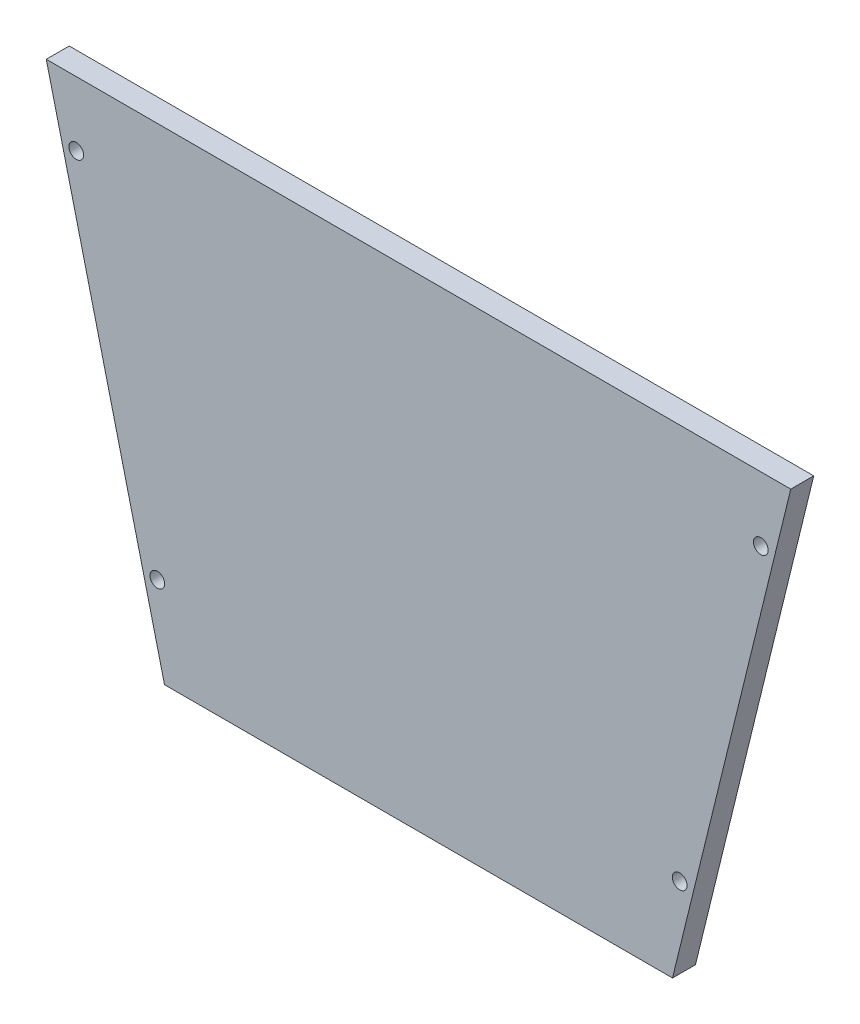
ISO-10303-21;
HEADER;
FILE_DESCRIPTION(('STEP AP214'),'2;1');
FILE_NAME('part.step','',(''),(''),'','','');
FILE_SCHEMA(('AUTOMOTIVE_DESIGN { 1 0 10303 214 1 1 1 1 }'));
ENDSEC;
DATA;
#1=APPLICATION_CONTEXT('core data for automotive mechanical design processes');
#2=APPLICATION_PROTOCOL_DEFINITION('international standard','automotive_design',2000,#1);
#3=PRODUCT_CONTEXT('',#1,'mechanical');
#4=PRODUCT('Part','Part','',(#3));
#5=PRODUCT_RELATED_PRODUCT_CATEGORY('part','',(#4));
#6=PRODUCT_DEFINITION_FORMATION('','',#4);
#7=PRODUCT_DEFINITION_CONTEXT('part definition',#1,'design');
#8=PRODUCT_DEFINITION('design','',#6,#7);
#9=PRODUCT_DEFINITION_SHAPE('','',#8);
#10=(LENGTH_UNIT() NAMED_UNIT(*) SI_UNIT(.MILLI.,.METRE.));
#11=(NAMED_UNIT(*) PLANE_ANGLE_UNIT() SI_UNIT($,.RADIAN.));
#12=(NAMED_UNIT(*) SI_UNIT($,.STERADIAN.) SOLID_ANGLE_UNIT());
#13=UNCERTAINTY_MEASURE_WITH_UNIT(LENGTH_MEASURE(1.E-05),#10,'distance_accuracy_value','');
#14=(GEOMETRIC_REPRESENTATION_CONTEXT(3) GLOBAL_UNCERTAINTY_ASSIGNED_CONTEXT((#13)) GLOBAL_UNIT_ASSIGNED_CONTEXT((#10,
#11,#12)) REPRESENTATION_CONTEXT('',''));
#15=CARTESIAN_POINT('',(0.,0.,0.));
#16=DIRECTION('',(0.,0.,1.));
#17=DIRECTION('',(1.,0.,0.));
#18=AXIS2_PLACEMENT_3D('',#15,#16,#17);
#19=CARTESIAN_POINT('',(-25.,102.,5.));
#20=DIRECTION('',(0.971252396495779,0.238052057964652,0.));
#21=DIRECTION('',(-0.238052057964652,0.971252396495779,0.));
#22=AXIS2_PLACEMENT_3D('',#19,#20,#21);
#23=PLANE('',#22);
#24=DIRECTION('',(0.238052057964652,-0.971252396495779,0.));
#25=VECTOR('',#24,1.);
#26=CARTESIAN_POINT('',(-25.,102.,5.));
#27=LINE('',#26,#25);
#28=CARTESIAN_POINT('',(-24.7549019607843,101.,5.));
#29=VERTEX_POINT('',#28);
#30=CARTESIAN_POINT('',(0.980392156862746,-4.,5.));
#31=VERTEX_POINT('',#30);
#32=EDGE_CURVE('E146',#29,#31,#27,.T.);
#33=ORIENTED_EDGE('',*,*,#32,.F.);
#34=DIRECTION('',(0.,0.,-1.));
#35=VECTOR('',#34,1.);
#36=CARTESIAN_POINT('',(-24.7549019607843,101.,5.));
#37=LINE('',#36,#35);
#38=CARTESIAN_POINT('',(-24.7549019607843,101.,0.));
#39=VERTEX_POINT('',#38);
#40=EDGE_CURVE('E81',#29,#39,#37,.T.);
#41=ORIENTED_EDGE('',*,*,#40,.T.);
#42=DIRECTION('',(0.238052057964652,-0.971252396495779,0.));
#43=VECTOR('',#42,1.);
#44=CARTESIAN_POINT('',(-25.,102.,0.));
#45=LINE('',#44,#43);
#46=CARTESIAN_POINT('',(0.980392156862746,-4.,0.));
#47=VERTEX_POINT('',#46);
#48=EDGE_CURVE('E76',#39,#47,#45,.T.);
#49=ORIENTED_EDGE('',*,*,#48,.T.);
#50=DIRECTION('',(0.,0.,1.));
#51=VECTOR('',#50,1.);
#52=CARTESIAN_POINT('',(0.980392156862746,-4.,0.));
#53=LINE('',#52,#51);
#54=EDGE_CURVE('E79',#47,#31,#53,.T.);
#55=ORIENTED_EDGE('',*,*,#54,.T.);
#56=EDGE_LOOP('',(#33,#41,#49,#55));
#57=FACE_BOUND('',#56,.T.);
#58=ADVANCED_FACE('F39',(#57),#23,.F.);
#59=CARTESIAN_POINT('',(112.5,0.,5.));
#60=DIRECTION('',(-0.971252396495779,0.238052057964652,0.));
#61=DIRECTION('',(-0.238052057964652,-0.971252396495779,0.));
#62=AXIS2_PLACEMENT_3D('',#59,#60,#61);
#63=PLANE('',#62);
#64=DIRECTION('',(0.238052057964652,0.971252396495779,0.));
#65=VECTOR('',#64,1.);
#66=CARTESIAN_POINT('',(112.5,0.,0.));
#67=LINE('',#66,#65);
#68=CARTESIAN_POINT('',(111.519607843137,-4.,0.));
#69=VERTEX_POINT('',#68);
#70=CARTESIAN_POINT('',(137.254901960784,101.,0.));
#71=VERTEX_POINT('',#70);
#72=EDGE_CURVE('E85',#69,#71,#67,.T.);
#73=ORIENTED_EDGE('',*,*,#72,.T.);
#74=DIRECTION('',(0.,0.,1.));
#75=VECTOR('',#74,1.);
#76=CARTESIAN_POINT('',(137.254901960784,101.,5.));
#77=LINE('',#76,#75);
#78=CARTESIAN_POINT('',(137.254901960784,101.,5.));
#79=VERTEX_POINT('',#78);
#80=EDGE_CURVE('E54',#71,#79,#77,.T.);
#81=ORIENTED_EDGE('',*,*,#80,.T.);
#82=DIRECTION('',(0.238052057964652,0.971252396495779,0.));
#83=VECTOR('',#82,1.);
#84=CARTESIAN_POINT('',(112.5,0.,5.));
#85=LINE('',#84,#83);
#86=CARTESIAN_POINT('',(111.519607843137,-4.,5.));
#87=VERTEX_POINT('',#86);
#88=EDGE_CURVE('E47',#87,#79,#85,.T.);
#89=ORIENTED_EDGE('',*,*,#88,.F.);
#90=DIRECTION('',(0.,0.,1.));
#91=VECTOR('',#90,1.);
#92=CARTESIAN_POINT('',(111.519607843137,-4.,0.));
#93=LINE('',#92,#91);
#94=EDGE_CURVE('E96',#69,#87,#93,.T.);
#95=ORIENTED_EDGE('',*,*,#94,.F.);
#96=EDGE_LOOP('',(#73,#81,#89,#95));
#97=FACE_BOUND('',#96,.T.);
#98=ADVANCED_FACE('F153',(#97),#63,.F.);
#99=CARTESIAN_POINT('',(0.,0.,5.));
#100=DIRECTION('',(0.,0.,1.));
#101=DIRECTION('',(1.,0.,0.));
#102=AXIS2_PLACEMENT_3D('',#99,#100,#101);
#103=PLANE('',#102);
#104=DIRECTION('',(1.,0.,0.));
#105=VECTOR('',#104,1.);
#106=CARTESIAN_POINT('',(-25.,101.,5.));
#107=LINE('',#106,#105);
#108=EDGE_CURVE('E107',#29,#79,#107,.T.);
#109=ORIENTED_EDGE('',*,*,#108,.F.);
#110=ORIENTED_EDGE('',*,*,#32,.T.);
#111=DIRECTION('',(1.,0.,0.));
#112=VECTOR('',#111,1.);
#113=CARTESIAN_POINT('',(0.980392156862746,-4.,5.));
#114=LINE('',#113,#112);
#115=EDGE_CURVE('E94',#31,#87,#114,.T.);
#116=ORIENTED_EDGE('',*,*,#115,.T.);
#117=ORIENTED_EDGE('',*,*,#88,.T.);
#118=EDGE_LOOP('',(#109,#110,#116,#117));
#119=FACE_BOUND('',#118,.T.);
#120=CARTESIAN_POINT('',(-18.2347339443622,87.,5.));
#121=DIRECTION('',(0.,0.,1.));
#122=DIRECTION('',(1.,0.,0.));
#123=AXIS2_PLACEMENT_3D('',#120,#121,#122);
#124=CIRCLE('',#123,1.60000000000001);
#125=CARTESIAN_POINT('',(-16.6347339443622,87.,5.));
#126=VERTEX_POINT('',#125);
#127=EDGE_CURVE('E119',#126,#126,#124,.T.);
#128=ORIENTED_EDGE('',*,*,#127,.F.);
#129=EDGE_LOOP('',(#128));
#130=FACE_BOUND('',#129,.T.);
#131=CARTESIAN_POINT('',(113.087675120833,15.,5.));
#132=DIRECTION('',(0.,0.,1.));
#133=DIRECTION('',(1.,0.,0.));
#134=AXIS2_PLACEMENT_3D('',#131,#132,#133);
#135=CIRCLE('',#134,1.6);
#136=CARTESIAN_POINT('',(114.687675120833,15.,5.));
#137=VERTEX_POINT('',#136);
#138=EDGE_CURVE('E127',#137,#137,#135,.T.);
#139=ORIENTED_EDGE('',*,*,#138,.F.);
#140=EDGE_LOOP('',(#139));
#141=FACE_BOUND('',#140,.T.);
#142=CARTESIAN_POINT('',(-0.58767512083277,15.,5.));
#143=DIRECTION('',(0.,0.,1.));
#144=DIRECTION('',(1.,0.,0.));
#145=AXIS2_PLACEMENT_3D('',#142,#143,#144);
#146=CIRCLE('',#145,1.6);
#147=CARTESIAN_POINT('',(1.01232487916723,15.,5.));
#148=VERTEX_POINT('',#147);
#149=EDGE_CURVE('E135',#148,#148,#146,.T.);
#150=ORIENTED_EDGE('',*,*,#149,.F.);
#151=EDGE_LOOP('',(#150));
#152=FACE_BOUND('',#151,.T.);
#153=CARTESIAN_POINT('',(130.734733944362,87.,5.));
#154=DIRECTION('',(0.,0.,1.));
#155=DIRECTION('',(1.,0.,0.));
#156=AXIS2_PLACEMENT_3D('',#153,#154,#155);
#157=CIRCLE('',#156,1.60000000000002);
#158=CARTESIAN_POINT('',(132.334733944362,87.,5.));
#159=VERTEX_POINT('',#158);
#160=EDGE_CURVE('E115',#159,#159,#157,.T.);
#161=ORIENTED_EDGE('',*,*,#160,.F.);
#162=EDGE_LOOP('',(#161));
#163=FACE_BOUND('',#162,.T.);
#164=ADVANCED_FACE('F156',(#119,#130,#141,#152,#163),#103,.T.);
#165=CARTESIAN_POINT('',(0.,0.,0.));
#166=DIRECTION('',(0.,0.,1.));
#167=DIRECTION('',(1.,0.,0.));
#168=AXIS2_PLACEMENT_3D('',#165,#166,#167);
#169=PLANE('',#168);
#170=CARTESIAN_POINT('',(-18.2347339443622,87.,0.));
#171=DIRECTION('',(0.,0.,1.));
#172=DIRECTION('',(1.,0.,0.));
#173=AXIS2_PLACEMENT_3D('',#170,#171,#172);
#174=CIRCLE('',#173,1.60000000000001);
#175=CARTESIAN_POINT('',(-16.6347339443622,87.,0.));
#176=VERTEX_POINT('',#175);
#177=EDGE_CURVE('E86',#176,#176,#174,.T.);
#178=ORIENTED_EDGE('',*,*,#177,.T.);
#179=EDGE_LOOP('',(#178));
#180=FACE_BOUND('',#179,.T.);
#181=CARTESIAN_POINT('',(113.087675120833,15.,0.));
#182=DIRECTION('',(0.,0.,1.));
#183=DIRECTION('',(1.,0.,0.));
#184=AXIS2_PLACEMENT_3D('',#181,#182,#183);
#185=CIRCLE('',#184,1.6);
#186=CARTESIAN_POINT('',(114.687675120833,15.,0.));
#187=VERTEX_POINT('',#186);
#188=EDGE_CURVE('E123',#187,#187,#185,.T.);
#189=ORIENTED_EDGE('',*,*,#188,.T.);
#190=EDGE_LOOP('',(#189));
#191=FACE_BOUND('',#190,.T.);
#192=CARTESIAN_POINT('',(-0.58767512083277,15.,0.));
#193=DIRECTION('',(0.,0.,1.));
#194=DIRECTION('',(1.,0.,0.));
#195=AXIS2_PLACEMENT_3D('',#192,#193,#194);
#196=CIRCLE('',#195,1.6);
#197=CARTESIAN_POINT('',(1.01232487916723,15.,0.));
#198=VERTEX_POINT('',#197);
#199=EDGE_CURVE('E131',#198,#198,#196,.T.);
#200=ORIENTED_EDGE('',*,*,#199,.T.);
#201=EDGE_LOOP('',(#200));
#202=FACE_BOUND('',#201,.T.);
#203=CARTESIAN_POINT('',(130.734733944362,87.,0.));
#204=DIRECTION('',(0.,0.,1.));
#205=DIRECTION('',(1.,0.,0.));
#206=AXIS2_PLACEMENT_3D('',#203,#204,#205);
#207=CIRCLE('',#206,1.60000000000002);
#208=CARTESIAN_POINT('',(132.334733944362,87.,0.));
#209=VERTEX_POINT('',#208);
#210=EDGE_CURVE('E139',#209,#209,#207,.T.);
#211=ORIENTED_EDGE('',*,*,#210,.T.);
#212=EDGE_LOOP('',(#211));
#213=FACE_BOUND('',#212,.T.);
#214=ORIENTED_EDGE('',*,*,#48,.F.);
#215=DIRECTION('',(1.,0.,0.));
#216=VECTOR('',#215,1.);
#217=CARTESIAN_POINT('',(0.,101.,0.));
#218=LINE('',#217,#216);
#219=EDGE_CURVE('E11',#39,#71,#218,.T.);
#220=ORIENTED_EDGE('',*,*,#219,.T.);
#221=ORIENTED_EDGE('',*,*,#72,.F.);
#222=DIRECTION('',(1.,0.,0.));
#223=VECTOR('',#222,1.);
#224=CARTESIAN_POINT('',(0.980392156862746,-4.,0.));
#225=LINE('',#224,#223);
#226=EDGE_CURVE('E92',#47,#69,#225,.T.);
#227=ORIENTED_EDGE('',*,*,#226,.F.);
#228=EDGE_LOOP('',(#214,#220,#221,#227));
#229=FACE_BOUND('',#228,.T.);
#230=ADVANCED_FACE('F98',(#180,#191,#202,#213,#229),#169,.F.);
#231=CARTESIAN_POINT('',(130.734733944362,87.,0.));
#232=DIRECTION('',(0.,0.,1.));
#233=DIRECTION('',(1.,0.,0.));
#234=AXIS2_PLACEMENT_3D('',#231,#232,#233);
#235=CYLINDRICAL_SURFACE('',#234,1.60000000000002);
#236=ORIENTED_EDGE('',*,*,#210,.F.);
#237=EDGE_LOOP('',(#236));
#238=FACE_BOUND('',#237,.T.);
#239=ORIENTED_EDGE('',*,*,#160,.T.);
#240=EDGE_LOOP('',(#239));
#241=FACE_BOUND('',#240,.T.);
#242=ADVANCED_FACE('F180',(#238,#241),#235,.F.);
#243=CARTESIAN_POINT('',(-0.58767512083277,15.,0.));
#244=DIRECTION('',(0.,0.,1.));
#245=DIRECTION('',(1.,0.,0.));
#246=AXIS2_PLACEMENT_3D('',#243,#244,#245);
#247=CYLINDRICAL_SURFACE('',#246,1.6);
#248=ORIENTED_EDGE('',*,*,#199,.F.);
#249=EDGE_LOOP('',(#248));
#250=FACE_BOUND('',#249,.T.);
#251=ORIENTED_EDGE('',*,*,#149,.T.);
#252=EDGE_LOOP('',(#251));
#253=FACE_BOUND('',#252,.T.);
#254=ADVANCED_FACE('F185',(#250,#253),#247,.F.);
#255=CARTESIAN_POINT('',(113.087675120833,15.,0.));
#256=DIRECTION('',(0.,0.,1.));
#257=DIRECTION('',(1.,0.,0.));
#258=AXIS2_PLACEMENT_3D('',#255,#256,#257);
#259=CYLINDRICAL_SURFACE('',#258,1.6);
#260=ORIENTED_EDGE('',*,*,#188,.F.);
#261=EDGE_LOOP('',(#260));
#262=FACE_BOUND('',#261,.T.);
#263=ORIENTED_EDGE('',*,*,#138,.T.);
#264=EDGE_LOOP('',(#263));
#265=FACE_BOUND('',#264,.T.);
#266=ADVANCED_FACE('F167',(#262,#265),#259,.F.);
#267=CARTESIAN_POINT('',(-18.2347339443622,87.,0.));
#268=DIRECTION('',(0.,0.,1.));
#269=DIRECTION('',(1.,0.,0.));
#270=AXIS2_PLACEMENT_3D('',#267,#268,#269);
#271=CYLINDRICAL_SURFACE('',#270,1.60000000000001);
#272=ORIENTED_EDGE('',*,*,#177,.F.);
#273=EDGE_LOOP('',(#272));
#274=FACE_BOUND('',#273,.T.);
#275=ORIENTED_EDGE('',*,*,#127,.T.);
#276=EDGE_LOOP('',(#275));
#277=FACE_BOUND('',#276,.T.);
#278=ADVANCED_FACE('F160',(#274,#277),#271,.F.);
#279=CARTESIAN_POINT('',(-25.,101.,0.));
#280=DIRECTION('',(0.,-1.,0.));
#281=DIRECTION('',(0.,0.,-1.));
#282=AXIS2_PLACEMENT_3D('',#279,#280,#281);
#283=PLANE('',#282);
#284=ORIENTED_EDGE('',*,*,#108,.T.);
#285=ORIENTED_EDGE('',*,*,#80,.F.);
#286=ORIENTED_EDGE('',*,*,#219,.F.);
#287=ORIENTED_EDGE('',*,*,#40,.F.);
#288=EDGE_LOOP('',(#284,#285,#286,#287));
#289=FACE_BOUND('',#288,.T.);
#290=ADVANCED_FACE('F158',(#289),#283,.F.);
#291=CARTESIAN_POINT('',(0.980392156862746,-4.,0.));
#292=DIRECTION('',(0.,-1.,0.));
#293=DIRECTION('',(0.,0.,-1.));
#294=AXIS2_PLACEMENT_3D('',#291,#292,#293);
#295=PLANE('',#294);
#296=ORIENTED_EDGE('',*,*,#115,.F.);
#297=ORIENTED_EDGE('',*,*,#54,.F.);
#298=ORIENTED_EDGE('',*,*,#226,.T.);
#299=ORIENTED_EDGE('',*,*,#94,.T.);
#300=EDGE_LOOP('',(#296,#297,#298,#299));
#301=FACE_BOUND('',#300,.T.);
#302=ADVANCED_FACE('F90',(#301),#295,.T.);
#303=CLOSED_SHELL('',(#58,#98,#164,#230,#242,#254,#266,#278,#290,#302));
#304=MANIFOLD_SOLID_BREP('B2',#303);
#305=ADVANCED_BREP_SHAPE_REPRESENTATION('',(#18,#304),#14);
#306=SHAPE_DEFINITION_REPRESENTATION(#9,#305);
ENDSEC;
END-ISO-10303-21;
